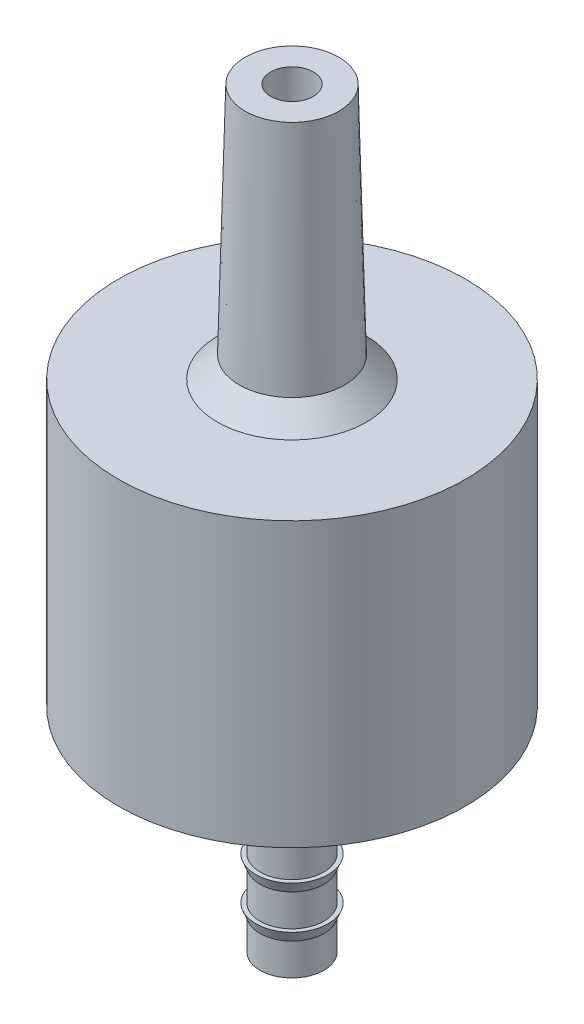
ISO-10303-21;
HEADER;
FILE_DESCRIPTION(('STEP AP214'),'2;1');
FILE_NAME('part.step','',(''),(''),'','','');
FILE_SCHEMA(('AUTOMOTIVE_DESIGN { 1 0 10303 214 1 1 1 1 }'));
ENDSEC;
DATA;
#1=APPLICATION_CONTEXT('core data for automotive mechanical design processes');
#2=APPLICATION_PROTOCOL_DEFINITION('international standard','automotive_design',2000,#1);
#3=PRODUCT_CONTEXT('',#1,'mechanical');
#4=PRODUCT('Part','Part','',(#3));
#5=PRODUCT_RELATED_PRODUCT_CATEGORY('part','',(#4));
#6=PRODUCT_DEFINITION_FORMATION('','',#4);
#7=PRODUCT_DEFINITION_CONTEXT('part definition',#1,'design');
#8=PRODUCT_DEFINITION('design','',#6,#7);
#9=PRODUCT_DEFINITION_SHAPE('','',#8);
#10=(LENGTH_UNIT() NAMED_UNIT(*) SI_UNIT(.MILLI.,.METRE.));
#11=(NAMED_UNIT(*) PLANE_ANGLE_UNIT() SI_UNIT($,.RADIAN.));
#12=(NAMED_UNIT(*) SI_UNIT($,.STERADIAN.) SOLID_ANGLE_UNIT());
#13=UNCERTAINTY_MEASURE_WITH_UNIT(LENGTH_MEASURE(1.E-05),#10,'distance_accuracy_value','');
#14=(GEOMETRIC_REPRESENTATION_CONTEXT(3) GLOBAL_UNCERTAINTY_ASSIGNED_CONTEXT((#13)) GLOBAL_UNIT_ASSIGNED_CONTEXT((#10,
#11,#12)) REPRESENTATION_CONTEXT('',''));
#15=CARTESIAN_POINT('',(0.,0.,0.));
#16=DIRECTION('',(0.,0.,1.));
#17=DIRECTION('',(1.,0.,0.));
#18=AXIS2_PLACEMENT_3D('',#15,#16,#17);
#19=CARTESIAN_POINT('',(0.,0.,0.));
#20=DIRECTION('',(0.,-1.,0.));
#21=DIRECTION('',(0.,0.,-1.));
#22=AXIS2_PLACEMENT_3D('',#19,#20,#21);
#23=CONICAL_SURFACE('',#22,2.5,0.0249947936189201);
#24=CARTESIAN_POINT('',(0.,12.,0.));
#25=DIRECTION('',(0.,1.,0.));
#26=DIRECTION('',(0.,0.,1.));
#27=AXIS2_PLACEMENT_3D('',#24,#25,#26);
#28=CIRCLE('',#27,2.2);
#29=CARTESIAN_POINT('',(0.,12.,2.2));
#30=VERTEX_POINT('',#29);
#31=EDGE_CURVE('E57',#30,#30,#28,.T.);
#32=ORIENTED_EDGE('',*,*,#31,.F.);
#33=EDGE_LOOP('',(#32));
#34=FACE_BOUND('',#33,.T.);
#35=CARTESIAN_POINT('',(0.,0.999687646408126,0.));
#36=DIRECTION('',(0.,-1.,0.));
#37=DIRECTION('',(0.,0.,-1.));
#38=AXIS2_PLACEMENT_3D('',#35,#36,#37);
#39=CIRCLE('',#38,2.4750078088398);
#40=CARTESIAN_POINT('',(0.,0.999687646408126,-2.4750078088398));
#41=VERTEX_POINT('',#40);
#42=EDGE_CURVE('E10',#41,#41,#39,.T.);
#43=ORIENTED_EDGE('',*,*,#42,.F.);
#44=EDGE_LOOP('',(#43));
#45=FACE_BOUND('',#44,.T.);
#46=ADVANCED_FACE('F31',(#34,#45),#23,.T.);
#47=CARTESIAN_POINT('',(2.5,0.,0.));
#48=DIRECTION('',(0.,-1.,0.));
#49=DIRECTION('',(0.,0.,-1.));
#50=AXIS2_PLACEMENT_3D('',#47,#48,#49);
#51=PLANE('',#50);
#52=CARTESIAN_POINT('',(0.,0.,0.));
#53=DIRECTION('',(0.,1.,0.));
#54=DIRECTION('',(0.,0.,1.));
#55=AXIS2_PLACEMENT_3D('',#52,#53,#54);
#56=CIRCLE('',#55,8.15);
#57=CARTESIAN_POINT('',(0.,0.,8.15));
#58=VERTEX_POINT('',#57);
#59=EDGE_CURVE('E60',#58,#58,#56,.T.);
#60=ORIENTED_EDGE('',*,*,#59,.T.);
#61=EDGE_LOOP('',(#60));
#62=FACE_BOUND('',#61,.T.);
#63=CARTESIAN_POINT('',(0.,0.,0.));
#64=DIRECTION('',(0.,-1.,0.));
#65=DIRECTION('',(0.,0.,-1.));
#66=AXIS2_PLACEMENT_3D('',#63,#64,#65);
#67=CIRCLE('',#66,3.5);
#68=CARTESIAN_POINT('',(0.,0.,-3.5));
#69=VERTEX_POINT('',#68);
#70=EDGE_CURVE('E38',#69,#69,#67,.F.);
#71=ORIENTED_EDGE('',*,*,#70,.F.);
#72=EDGE_LOOP('',(#71));
#73=FACE_BOUND('',#72,.T.);
#74=ADVANCED_FACE('F130',(#62,#73),#51,.F.);
#75=CARTESIAN_POINT('',(0.,23.0580795282157,0.));
#76=DIRECTION('',(0.,1.,0.));
#77=DIRECTION('',(0.,0.,1.));
#78=AXIS2_PLACEMENT_3D('',#75,#76,#77);
#79=CYLINDRICAL_SURFACE('',#78,1.5);
#80=CARTESIAN_POINT('',(0.,-15.3,0.));
#81=DIRECTION('',(0.,1.,0.));
#82=DIRECTION('',(0.,0.,1.));
#83=AXIS2_PLACEMENT_3D('',#80,#81,#82);
#84=CIRCLE('',#83,1.5);
#85=CARTESIAN_POINT('',(0.,-15.3,1.5));
#86=VERTEX_POINT('',#85);
#87=EDGE_CURVE('E66',#86,#86,#84,.T.);
#88=ORIENTED_EDGE('',*,*,#87,.T.);
#89=EDGE_LOOP('',(#88));
#90=FACE_BOUND('',#89,.T.);
#91=CARTESIAN_POINT('',(0.,-14.8,0.));
#92=DIRECTION('',(0.,1.,0.));
#93=DIRECTION('',(0.,0.,1.));
#94=AXIS2_PLACEMENT_3D('',#91,#92,#93);
#95=CIRCLE('',#94,1.5);
#96=CARTESIAN_POINT('',(0.,-14.8,1.5));
#97=VERTEX_POINT('',#96);
#98=EDGE_CURVE('E46',#97,#97,#95,.T.);
#99=ORIENTED_EDGE('',*,*,#98,.F.);
#100=EDGE_LOOP('',(#99));
#101=FACE_BOUND('',#100,.T.);
#102=ADVANCED_FACE('F114',(#90,#101),#79,.T.);
#103=CARTESIAN_POINT('',(0.,0.,0.));
#104=DIRECTION('',(0.,1.,0.));
#105=DIRECTION('',(0.,0.,1.));
#106=AXIS2_PLACEMENT_3D('',#103,#104,#105);
#107=CONICAL_SURFACE('',#106,1.25,0.0107292020148093);
#108=CARTESIAN_POINT('',(0.,-23.3,0.));
#109=DIRECTION('',(0.,1.,0.));
#110=DIRECTION('',(0.,0.,1.));
#111=AXIS2_PLACEMENT_3D('',#108,#109,#110);
#112=CIRCLE('',#111,1.);
#113=CARTESIAN_POINT('',(0.,-23.3,1.));
#114=VERTEX_POINT('',#113);
#115=EDGE_CURVE('E105',#114,#114,#112,.T.);
#116=ORIENTED_EDGE('',*,*,#115,.F.);
#117=EDGE_LOOP('',(#116));
#118=FACE_BOUND('',#117,.T.);
#119=CARTESIAN_POINT('',(0.,0.,0.));
#120=DIRECTION('',(0.,1.,0.));
#121=DIRECTION('',(0.,0.,1.));
#122=AXIS2_PLACEMENT_3D('',#119,#120,#121);
#123=CIRCLE('',#122,1.25);
#124=CARTESIAN_POINT('',(0.,0.,1.25));
#125=VERTEX_POINT('',#124);
#126=EDGE_CURVE('E51',#125,#125,#123,.T.);
#127=ORIENTED_EDGE('',*,*,#126,.T.);
#128=EDGE_LOOP('',(#127));
#129=FACE_BOUND('',#128,.T.);
#130=ADVANCED_FACE('F33',(#118,#129),#107,.F.);
#131=CARTESIAN_POINT('',(0.,12.,0.));
#132=DIRECTION('',(0.,-1.,0.));
#133=DIRECTION('',(0.,0.,-1.));
#134=AXIS2_PLACEMENT_3D('',#131,#132,#133);
#135=CONICAL_SURFACE('',#134,1.,0.020830320036217);
#136=ORIENTED_EDGE('',*,*,#126,.F.);
#137=EDGE_LOOP('',(#136));
#138=FACE_BOUND('',#137,.T.);
#139=CARTESIAN_POINT('',(0.,12.,0.));
#140=DIRECTION('',(0.,1.,0.));
#141=DIRECTION('',(0.,0.,1.));
#142=AXIS2_PLACEMENT_3D('',#139,#140,#141);
#143=CIRCLE('',#142,1.);
#144=CARTESIAN_POINT('',(0.,12.,1.));
#145=VERTEX_POINT('',#144);
#146=EDGE_CURVE('E54',#145,#145,#143,.T.);
#147=ORIENTED_EDGE('',*,*,#146,.T.);
#148=EDGE_LOOP('',(#147));
#149=FACE_BOUND('',#148,.T.);
#150=ADVANCED_FACE('F113',(#138,#149),#135,.F.);
#151=CARTESIAN_POINT('',(1.,12.,0.));
#152=DIRECTION('',(0.,-1.,0.));
#153=DIRECTION('',(0.,0.,-1.));
#154=AXIS2_PLACEMENT_3D('',#151,#152,#153);
#155=PLANE('',#154);
#156=ORIENTED_EDGE('',*,*,#146,.F.);
#157=EDGE_LOOP('',(#156));
#158=FACE_BOUND('',#157,.T.);
#159=ORIENTED_EDGE('',*,*,#31,.T.);
#160=EDGE_LOOP('',(#159));
#161=FACE_BOUND('',#160,.T.);
#162=ADVANCED_FACE('F119',(#158,#161),#155,.F.);
#163=CARTESIAN_POINT('',(0.,23.0580795282157,0.));
#164=DIRECTION('',(0.,1.,0.));
#165=DIRECTION('',(0.,0.,1.));
#166=AXIS2_PLACEMENT_3D('',#163,#164,#165);
#167=CYLINDRICAL_SURFACE('',#166,8.15);
#168=ORIENTED_EDGE('',*,*,#59,.F.);
#169=EDGE_LOOP('',(#168));
#170=FACE_BOUND('',#169,.T.);
#171=CARTESIAN_POINT('',(0.,-13.3,0.));
#172=DIRECTION('',(0.,1.,0.));
#173=DIRECTION('',(0.,0.,1.));
#174=AXIS2_PLACEMENT_3D('',#171,#172,#173);
#175=CIRCLE('',#174,8.15);
#176=CARTESIAN_POINT('',(0.,-13.3,8.15));
#177=VERTEX_POINT('',#176);
#178=EDGE_CURVE('E63',#177,#177,#175,.T.);
#179=ORIENTED_EDGE('',*,*,#178,.T.);
#180=EDGE_LOOP('',(#179));
#181=FACE_BOUND('',#180,.T.);
#182=ADVANCED_FACE('F124',(#170,#181),#167,.T.);
#183=CARTESIAN_POINT('',(1.5,-13.3,0.));
#184=DIRECTION('',(0.,1.,0.));
#185=DIRECTION('',(0.,0.,1.));
#186=AXIS2_PLACEMENT_3D('',#183,#184,#185);
#187=PLANE('',#186);
#188=CARTESIAN_POINT('',(0.,-13.3,0.));
#189=DIRECTION('',(0.,1.,0.));
#190=DIRECTION('',(0.,0.,1.));
#191=AXIS2_PLACEMENT_3D('',#188,#189,#190);
#192=CIRCLE('',#191,2.5);
#193=CARTESIAN_POINT('',(0.,-13.3,2.5));
#194=VERTEX_POINT('',#193);
#195=EDGE_CURVE('E42',#194,#194,#192,.F.);
#196=ORIENTED_EDGE('',*,*,#195,.F.);
#197=EDGE_LOOP('',(#196));
#198=FACE_BOUND('',#197,.T.);
#199=ORIENTED_EDGE('',*,*,#178,.F.);
#200=EDGE_LOOP('',(#199));
#201=FACE_BOUND('',#200,.T.);
#202=ADVANCED_FACE('F140',(#198,#201),#187,.F.);
#203=CARTESIAN_POINT('',(1.5,-15.3,0.));
#204=DIRECTION('',(0.,-1.,0.));
#205=DIRECTION('',(0.,0.,-1.));
#206=AXIS2_PLACEMENT_3D('',#203,#204,#205);
#207=PLANE('',#206);
#208=ORIENTED_EDGE('',*,*,#87,.F.);
#209=EDGE_LOOP('',(#208));
#210=FACE_BOUND('',#209,.T.);
#211=CARTESIAN_POINT('',(0.,-15.3,0.));
#212=DIRECTION('',(0.,1.,0.));
#213=DIRECTION('',(0.,0.,1.));
#214=AXIS2_PLACEMENT_3D('',#211,#212,#213);
#215=CIRCLE('',#214,1.7);
#216=CARTESIAN_POINT('',(0.,-15.3,1.7));
#217=VERTEX_POINT('',#216);
#218=EDGE_CURVE('E69',#217,#217,#215,.T.);
#219=ORIENTED_EDGE('',*,*,#218,.T.);
#220=EDGE_LOOP('',(#219));
#221=FACE_BOUND('',#220,.T.);
#222=ADVANCED_FACE('F144',(#210,#221),#207,.F.);
#223=CARTESIAN_POINT('',(0.,-15.8,0.));
#224=DIRECTION('',(0.,1.,0.));
#225=DIRECTION('',(0.,0.,1.));
#226=AXIS2_PLACEMENT_3D('',#223,#224,#225);
#227=CONICAL_SURFACE('',#226,1.5,0.380506377112365);
#228=ORIENTED_EDGE('',*,*,#218,.F.);
#229=EDGE_LOOP('',(#228));
#230=FACE_BOUND('',#229,.T.);
#231=CARTESIAN_POINT('',(0.,-15.8,0.));
#232=DIRECTION('',(0.,1.,0.));
#233=DIRECTION('',(0.,0.,1.));
#234=AXIS2_PLACEMENT_3D('',#231,#232,#233);
#235=CIRCLE('',#234,1.5);
#236=CARTESIAN_POINT('',(0.,-15.8,1.5));
#237=VERTEX_POINT('',#236);
#238=EDGE_CURVE('E72',#237,#237,#235,.T.);
#239=ORIENTED_EDGE('',*,*,#238,.T.);
#240=EDGE_LOOP('',(#239));
#241=FACE_BOUND('',#240,.T.);
#242=ADVANCED_FACE('F151',(#230,#241),#227,.T.);
#243=CARTESIAN_POINT('',(0.,23.0580795282157,0.));
#244=DIRECTION('',(0.,1.,0.));
#245=DIRECTION('',(0.,0.,1.));
#246=AXIS2_PLACEMENT_3D('',#243,#244,#245);
#247=CYLINDRICAL_SURFACE('',#246,1.5);
#248=ORIENTED_EDGE('',*,*,#238,.F.);
#249=EDGE_LOOP('',(#248));
#250=FACE_BOUND('',#249,.T.);
#251=CARTESIAN_POINT('',(0.,-17.3,0.));
#252=DIRECTION('',(0.,1.,0.));
#253=DIRECTION('',(0.,0.,1.));
#254=AXIS2_PLACEMENT_3D('',#251,#252,#253);
#255=CIRCLE('',#254,1.5);
#256=CARTESIAN_POINT('',(0.,-17.3,1.5));
#257=VERTEX_POINT('',#256);
#258=EDGE_CURVE('E75',#257,#257,#255,.T.);
#259=ORIENTED_EDGE('',*,*,#258,.T.);
#260=EDGE_LOOP('',(#259));
#261=FACE_BOUND('',#260,.T.);
#262=ADVANCED_FACE('F155',(#250,#261),#247,.T.);
#263=CARTESIAN_POINT('',(1.5,-17.3,0.));
#264=DIRECTION('',(0.,-1.,0.));
#265=DIRECTION('',(0.,0.,-1.));
#266=AXIS2_PLACEMENT_3D('',#263,#264,#265);
#267=PLANE('',#266);
#268=ORIENTED_EDGE('',*,*,#258,.F.);
#269=EDGE_LOOP('',(#268));
#270=FACE_BOUND('',#269,.T.);
#271=CARTESIAN_POINT('',(0.,-17.3,0.));
#272=DIRECTION('',(0.,1.,0.));
#273=DIRECTION('',(0.,0.,1.));
#274=AXIS2_PLACEMENT_3D('',#271,#272,#273);
#275=CIRCLE('',#274,1.7);
#276=CARTESIAN_POINT('',(0.,-17.3,1.7));
#277=VERTEX_POINT('',#276);
#278=EDGE_CURVE('E78',#277,#277,#275,.T.);
#279=ORIENTED_EDGE('',*,*,#278,.T.);
#280=EDGE_LOOP('',(#279));
#281=FACE_BOUND('',#280,.T.);
#282=ADVANCED_FACE('F159',(#270,#281),#267,.F.);
#283=CARTESIAN_POINT('',(0.,-17.8,0.));
#284=DIRECTION('',(0.,1.,0.));
#285=DIRECTION('',(0.,0.,1.));
#286=AXIS2_PLACEMENT_3D('',#283,#284,#285);
#287=CONICAL_SURFACE('',#286,1.5,0.380506377112365);
#288=ORIENTED_EDGE('',*,*,#278,.F.);
#289=EDGE_LOOP('',(#288));
#290=FACE_BOUND('',#289,.T.);
#291=CARTESIAN_POINT('',(0.,-17.8,0.));
#292=DIRECTION('',(0.,1.,0.));
#293=DIRECTION('',(0.,0.,1.));
#294=AXIS2_PLACEMENT_3D('',#291,#292,#293);
#295=CIRCLE('',#294,1.5);
#296=CARTESIAN_POINT('',(0.,-17.8,1.5));
#297=VERTEX_POINT('',#296);
#298=EDGE_CURVE('E81',#297,#297,#295,.T.);
#299=ORIENTED_EDGE('',*,*,#298,.T.);
#300=EDGE_LOOP('',(#299));
#301=FACE_BOUND('',#300,.T.);
#302=ADVANCED_FACE('F163',(#290,#301),#287,.T.);
#303=CARTESIAN_POINT('',(0.,23.0580795282157,0.));
#304=DIRECTION('',(0.,1.,0.));
#305=DIRECTION('',(0.,0.,1.));
#306=AXIS2_PLACEMENT_3D('',#303,#304,#305);
#307=CYLINDRICAL_SURFACE('',#306,1.5);
#308=ORIENTED_EDGE('',*,*,#298,.F.);
#309=EDGE_LOOP('',(#308));
#310=FACE_BOUND('',#309,.T.);
#311=CARTESIAN_POINT('',(0.,-19.3,0.));
#312=DIRECTION('',(0.,1.,0.));
#313=DIRECTION('',(0.,0.,1.));
#314=AXIS2_PLACEMENT_3D('',#311,#312,#313);
#315=CIRCLE('',#314,1.5);
#316=CARTESIAN_POINT('',(0.,-19.3,1.5));
#317=VERTEX_POINT('',#316);
#318=EDGE_CURVE('E84',#317,#317,#315,.T.);
#319=ORIENTED_EDGE('',*,*,#318,.T.);
#320=EDGE_LOOP('',(#319));
#321=FACE_BOUND('',#320,.T.);
#322=ADVANCED_FACE('F167',(#310,#321),#307,.T.);
#323=CARTESIAN_POINT('',(1.5,-19.3,0.));
#324=DIRECTION('',(0.,-1.,0.));
#325=DIRECTION('',(0.,0.,-1.));
#326=AXIS2_PLACEMENT_3D('',#323,#324,#325);
#327=PLANE('',#326);
#328=ORIENTED_EDGE('',*,*,#318,.F.);
#329=EDGE_LOOP('',(#328));
#330=FACE_BOUND('',#329,.T.);
#331=CARTESIAN_POINT('',(0.,-19.3,0.));
#332=DIRECTION('',(0.,1.,0.));
#333=DIRECTION('',(0.,0.,1.));
#334=AXIS2_PLACEMENT_3D('',#331,#332,#333);
#335=CIRCLE('',#334,1.7);
#336=CARTESIAN_POINT('',(0.,-19.3,1.7));
#337=VERTEX_POINT('',#336);
#338=EDGE_CURVE('E87',#337,#337,#335,.T.);
#339=ORIENTED_EDGE('',*,*,#338,.T.);
#340=EDGE_LOOP('',(#339));
#341=FACE_BOUND('',#340,.T.);
#342=ADVANCED_FACE('F171',(#330,#341),#327,.F.);
#343=CARTESIAN_POINT('',(0.,-19.8,0.));
#344=DIRECTION('',(0.,1.,0.));
#345=DIRECTION('',(0.,0.,1.));
#346=AXIS2_PLACEMENT_3D('',#343,#344,#345);
#347=CONICAL_SURFACE('',#346,1.5,0.380506377112365);
#348=ORIENTED_EDGE('',*,*,#338,.F.);
#349=EDGE_LOOP('',(#348));
#350=FACE_BOUND('',#349,.T.);
#351=CARTESIAN_POINT('',(0.,-19.8,0.));
#352=DIRECTION('',(0.,1.,0.));
#353=DIRECTION('',(0.,0.,1.));
#354=AXIS2_PLACEMENT_3D('',#351,#352,#353);
#355=CIRCLE('',#354,1.5);
#356=CARTESIAN_POINT('',(0.,-19.8,1.5));
#357=VERTEX_POINT('',#356);
#358=EDGE_CURVE('E90',#357,#357,#355,.T.);
#359=ORIENTED_EDGE('',*,*,#358,.T.);
#360=EDGE_LOOP('',(#359));
#361=FACE_BOUND('',#360,.T.);
#362=ADVANCED_FACE('F175',(#350,#361),#347,.T.);
#363=CARTESIAN_POINT('',(0.,23.0580795282157,0.));
#364=DIRECTION('',(0.,1.,0.));
#365=DIRECTION('',(0.,0.,1.));
#366=AXIS2_PLACEMENT_3D('',#363,#364,#365);
#367=CYLINDRICAL_SURFACE('',#366,1.5);
#368=ORIENTED_EDGE('',*,*,#358,.F.);
#369=EDGE_LOOP('',(#368));
#370=FACE_BOUND('',#369,.T.);
#371=CARTESIAN_POINT('',(0.,-21.3,0.));
#372=DIRECTION('',(0.,1.,0.));
#373=DIRECTION('',(0.,0.,1.));
#374=AXIS2_PLACEMENT_3D('',#371,#372,#373);
#375=CIRCLE('',#374,1.5);
#376=CARTESIAN_POINT('',(0.,-21.3,1.5));
#377=VERTEX_POINT('',#376);
#378=EDGE_CURVE('E93',#377,#377,#375,.T.);
#379=ORIENTED_EDGE('',*,*,#378,.T.);
#380=EDGE_LOOP('',(#379));
#381=FACE_BOUND('',#380,.T.);
#382=ADVANCED_FACE('F179',(#370,#381),#367,.T.);
#383=CARTESIAN_POINT('',(1.5,-21.3,0.));
#384=DIRECTION('',(0.,-1.,0.));
#385=DIRECTION('',(0.,0.,-1.));
#386=AXIS2_PLACEMENT_3D('',#383,#384,#385);
#387=PLANE('',#386);
#388=ORIENTED_EDGE('',*,*,#378,.F.);
#389=EDGE_LOOP('',(#388));
#390=FACE_BOUND('',#389,.T.);
#391=CARTESIAN_POINT('',(0.,-21.3,0.));
#392=DIRECTION('',(0.,1.,0.));
#393=DIRECTION('',(0.,0.,1.));
#394=AXIS2_PLACEMENT_3D('',#391,#392,#393);
#395=CIRCLE('',#394,1.7);
#396=CARTESIAN_POINT('',(0.,-21.3,1.7));
#397=VERTEX_POINT('',#396);
#398=EDGE_CURVE('E96',#397,#397,#395,.T.);
#399=ORIENTED_EDGE('',*,*,#398,.T.);
#400=EDGE_LOOP('',(#399));
#401=FACE_BOUND('',#400,.T.);
#402=ADVANCED_FACE('F183',(#390,#401),#387,.F.);
#403=CARTESIAN_POINT('',(0.,-21.8,0.));
#404=DIRECTION('',(0.,1.,0.));
#405=DIRECTION('',(0.,0.,1.));
#406=AXIS2_PLACEMENT_3D('',#403,#404,#405);
#407=CONICAL_SURFACE('',#406,1.5,0.380506377112365);
#408=ORIENTED_EDGE('',*,*,#398,.F.);
#409=EDGE_LOOP('',(#408));
#410=FACE_BOUND('',#409,.T.);
#411=CARTESIAN_POINT('',(0.,-21.8,0.));
#412=DIRECTION('',(0.,1.,0.));
#413=DIRECTION('',(0.,0.,1.));
#414=AXIS2_PLACEMENT_3D('',#411,#412,#413);
#415=CIRCLE('',#414,1.5);
#416=CARTESIAN_POINT('',(0.,-21.8,1.5));
#417=VERTEX_POINT('',#416);
#418=EDGE_CURVE('E99',#417,#417,#415,.T.);
#419=ORIENTED_EDGE('',*,*,#418,.T.);
#420=EDGE_LOOP('',(#419));
#421=FACE_BOUND('',#420,.T.);
#422=ADVANCED_FACE('F187',(#410,#421),#407,.T.);
#423=CARTESIAN_POINT('',(0.,23.0580795282157,0.));
#424=DIRECTION('',(0.,1.,0.));
#425=DIRECTION('',(0.,0.,1.));
#426=AXIS2_PLACEMENT_3D('',#423,#424,#425);
#427=CYLINDRICAL_SURFACE('',#426,1.5);
#428=ORIENTED_EDGE('',*,*,#418,.F.);
#429=EDGE_LOOP('',(#428));
#430=FACE_BOUND('',#429,.T.);
#431=CARTESIAN_POINT('',(0.,-23.3,0.));
#432=DIRECTION('',(0.,1.,0.));
#433=DIRECTION('',(0.,0.,1.));
#434=AXIS2_PLACEMENT_3D('',#431,#432,#433);
#435=CIRCLE('',#434,1.5);
#436=CARTESIAN_POINT('',(0.,-23.3,1.5));
#437=VERTEX_POINT('',#436);
#438=EDGE_CURVE('E102',#437,#437,#435,.T.);
#439=ORIENTED_EDGE('',*,*,#438,.T.);
#440=EDGE_LOOP('',(#439));
#441=FACE_BOUND('',#440,.T.);
#442=ADVANCED_FACE('F191',(#430,#441),#427,.T.);
#443=CARTESIAN_POINT('',(1.,-23.3,0.));
#444=DIRECTION('',(0.,1.,0.));
#445=DIRECTION('',(0.,0.,1.));
#446=AXIS2_PLACEMENT_3D('',#443,#444,#445);
#447=PLANE('',#446);
#448=ORIENTED_EDGE('',*,*,#438,.F.);
#449=EDGE_LOOP('',(#448));
#450=FACE_BOUND('',#449,.T.);
#451=ORIENTED_EDGE('',*,*,#115,.T.);
#452=EDGE_LOOP('',(#451));
#453=FACE_BOUND('',#452,.T.);
#454=ADVANCED_FACE('F109',(#450,#453),#447,.F.);
#455=CARTESIAN_POINT('',(0.,-14.8,0.));
#456=DIRECTION('',(0.,1.,0.));
#457=DIRECTION('',(0.,0.,1.));
#458=AXIS2_PLACEMENT_3D('',#455,#456,#457);
#459=CONICAL_SURFACE('',#458,1.5,0.588002603547567);
#460=ORIENTED_EDGE('',*,*,#195,.T.);
#461=EDGE_LOOP('',(#460));
#462=FACE_BOUND('',#461,.T.);
#463=ORIENTED_EDGE('',*,*,#98,.T.);
#464=EDGE_LOOP('',(#463));
#465=FACE_BOUND('',#464,.T.);
#466=ADVANCED_FACE('F198',(#462,#465),#459,.T.);
#467=CARTESIAN_POINT('',(0.,0.,0.));
#468=DIRECTION('',(0.,-1.,0.));
#469=DIRECTION('',(0.,0.,-1.));
#470=AXIS2_PLACEMENT_3D('',#467,#468,#469);
#471=CONICAL_SURFACE('',#470,3.5,0.797895560206908);
#472=ORIENTED_EDGE('',*,*,#42,.T.);
#473=EDGE_LOOP('',(#472));
#474=FACE_BOUND('',#473,.T.);
#475=ORIENTED_EDGE('',*,*,#70,.T.);
#476=EDGE_LOOP('',(#475));
#477=FACE_BOUND('',#476,.T.);
#478=ADVANCED_FACE('F202',(#474,#477),#471,.T.);
#479=CLOSED_SHELL('',(#46,#74,#102,#130,#150,#162,#182,#202,#222,#242,#262,#282,#302,#322,#342,
#362,#382,#402,#422,#442,#454,#466,#478));
#480=MANIFOLD_SOLID_BREP('B2',#479);
#481=ADVANCED_BREP_SHAPE_REPRESENTATION('',(#18,#480),#14);
#482=SHAPE_DEFINITION_REPRESENTATION(#9,#481);
ENDSEC;
END-ISO-10303-21;
